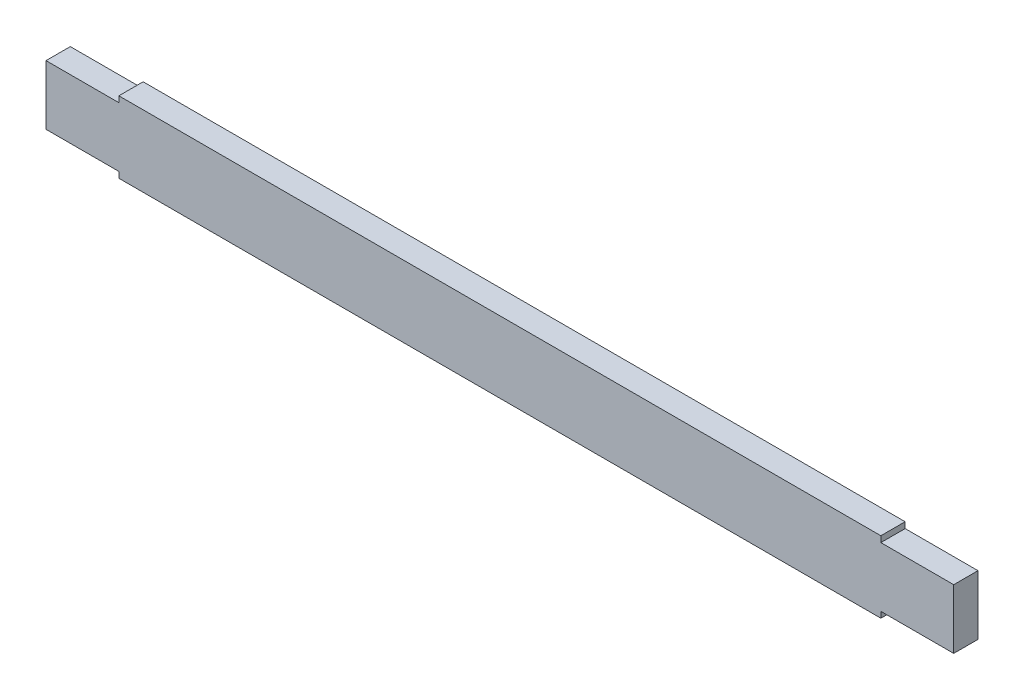
ISO-10303-21;
HEADER;
FILE_DESCRIPTION(('STEP AP214'),'2;1');
FILE_NAME('part.step','',(''),(''),'','','');
FILE_SCHEMA(('AUTOMOTIVE_DESIGN { 1 0 10303 214 1 1 1 1 }'));
ENDSEC;
DATA;
#1=APPLICATION_CONTEXT('core data for automotive mechanical design processes');
#2=APPLICATION_PROTOCOL_DEFINITION('international standard','automotive_design',2000,#1);
#3=PRODUCT_CONTEXT('',#1,'mechanical');
#4=PRODUCT('Part','Part','',(#3));
#5=PRODUCT_RELATED_PRODUCT_CATEGORY('part','',(#4));
#6=PRODUCT_DEFINITION_FORMATION('','',#4);
#7=PRODUCT_DEFINITION_CONTEXT('part definition',#1,'design');
#8=PRODUCT_DEFINITION('design','',#6,#7);
#9=PRODUCT_DEFINITION_SHAPE('','',#8);
#10=(LENGTH_UNIT() NAMED_UNIT(*) SI_UNIT(.MILLI.,.METRE.));
#11=(NAMED_UNIT(*) PLANE_ANGLE_UNIT() SI_UNIT($,.RADIAN.));
#12=(NAMED_UNIT(*) SI_UNIT($,.STERADIAN.) SOLID_ANGLE_UNIT());
#13=UNCERTAINTY_MEASURE_WITH_UNIT(LENGTH_MEASURE(1.E-05),#10,'distance_accuracy_value','');
#14=(GEOMETRIC_REPRESENTATION_CONTEXT(3) GLOBAL_UNCERTAINTY_ASSIGNED_CONTEXT((#13)) GLOBAL_UNIT_ASSIGNED_CONTEXT((#10,
#11,#12)) REPRESENTATION_CONTEXT('',''));
#15=CARTESIAN_POINT('',(0.,0.,0.));
#16=DIRECTION('',(0.,0.,1.));
#17=DIRECTION('',(1.,0.,0.));
#18=AXIS2_PLACEMENT_3D('',#15,#16,#17);
#19=CARTESIAN_POINT('',(80.,7.50000000000001,5.1));
#20=DIRECTION('',(0.,-1.,0.));
#21=DIRECTION('',(1.,0.,0.));
#22=AXIS2_PLACEMENT_3D('',#19,#20,#21);
#23=PLANE('',#22);
#24=DIRECTION('',(-1.,0.,0.));
#25=VECTOR('',#24,1.);
#26=CARTESIAN_POINT('',(80.,7.50000000000001,0.));
#27=LINE('',#26,#25);
#28=CARTESIAN_POINT('',(80.,7.50000000000001,0.));
#29=VERTEX_POINT('',#28);
#30=CARTESIAN_POINT('',(-80.,7.49999999999999,0.));
#31=VERTEX_POINT('',#30);
#32=EDGE_CURVE('E153',#29,#31,#27,.T.);
#33=ORIENTED_EDGE('',*,*,#32,.T.);
#34=DIRECTION('',(0.,0.,-1.));
#35=VECTOR('',#34,1.);
#36=CARTESIAN_POINT('',(-80.,7.49999999999999,5.1));
#37=LINE('',#36,#35);
#38=CARTESIAN_POINT('',(-80.,7.49999999999999,5.1));
#39=VERTEX_POINT('',#38);
#40=EDGE_CURVE('E11',#39,#31,#37,.T.);
#41=ORIENTED_EDGE('',*,*,#40,.F.);
#42=DIRECTION('',(-1.,0.,0.));
#43=VECTOR('',#42,1.);
#44=CARTESIAN_POINT('',(80.,7.50000000000001,5.1));
#45=LINE('',#44,#43);
#46=CARTESIAN_POINT('',(80.,7.50000000000001,5.1));
#47=VERTEX_POINT('',#46);
#48=EDGE_CURVE('E175',#47,#39,#45,.T.);
#49=ORIENTED_EDGE('',*,*,#48,.F.);
#50=DIRECTION('',(0.,0.,-1.));
#51=VECTOR('',#50,1.);
#52=CARTESIAN_POINT('',(80.,7.50000000000001,5.1));
#53=LINE('',#52,#51);
#54=EDGE_CURVE('E149',#47,#29,#53,.T.);
#55=ORIENTED_EDGE('',*,*,#54,.T.);
#56=EDGE_LOOP('',(#33,#41,#49,#55));
#57=FACE_BOUND('',#56,.T.);
#58=ADVANCED_FACE('F33',(#57),#23,.F.);
#59=CARTESIAN_POINT('',(-80.,6.25,5.1));
#60=DIRECTION('',(1.,0.,0.));
#61=DIRECTION('',(0.,0.,-1.));
#62=AXIS2_PLACEMENT_3D('',#59,#60,#61);
#63=PLANE('',#62);
#64=DIRECTION('',(0.,-1.,0.));
#65=VECTOR('',#64,1.);
#66=CARTESIAN_POINT('',(-80.,6.25,0.));
#67=LINE('',#66,#65);
#68=CARTESIAN_POINT('',(-80.,6.25,0.));
#69=VERTEX_POINT('',#68);
#70=EDGE_CURVE('E156',#31,#69,#67,.T.);
#71=ORIENTED_EDGE('',*,*,#70,.T.);
#72=DIRECTION('',(0.,0.,-1.));
#73=VECTOR('',#72,1.);
#74=CARTESIAN_POINT('',(-80.,6.25,5.1));
#75=LINE('',#74,#73);
#76=CARTESIAN_POINT('',(-80.,6.25,5.1));
#77=VERTEX_POINT('',#76);
#78=EDGE_CURVE('E41',#77,#69,#75,.T.);
#79=ORIENTED_EDGE('',*,*,#78,.F.);
#80=DIRECTION('',(0.,-1.,0.));
#81=VECTOR('',#80,1.);
#82=CARTESIAN_POINT('',(-80.,6.25,5.1));
#83=LINE('',#82,#81);
#84=EDGE_CURVE('E104',#39,#77,#83,.T.);
#85=ORIENTED_EDGE('',*,*,#84,.F.);
#86=ORIENTED_EDGE('',*,*,#40,.T.);
#87=EDGE_LOOP('',(#71,#79,#85,#86));
#88=FACE_BOUND('',#87,.T.);
#89=ADVANCED_FACE('F253',(#88),#63,.F.);
#90=CARTESIAN_POINT('',(-80.,6.25,5.1));
#91=DIRECTION('',(0.,-1.,0.));
#92=DIRECTION('',(1.,0.,0.));
#93=AXIS2_PLACEMENT_3D('',#90,#91,#92);
#94=PLANE('',#93);
#95=DIRECTION('',(-1.,0.,0.));
#96=VECTOR('',#95,1.);
#97=CARTESIAN_POINT('',(-80.,6.25,0.));
#98=LINE('',#97,#96);
#99=CARTESIAN_POINT('',(-95.3,6.25,0.));
#100=VERTEX_POINT('',#99);
#101=EDGE_CURVE('E158',#69,#100,#98,.T.);
#102=ORIENTED_EDGE('',*,*,#101,.T.);
#103=DIRECTION('',(0.,0.,-1.));
#104=VECTOR('',#103,1.);
#105=CARTESIAN_POINT('',(-95.3,6.25,5.1));
#106=LINE('',#105,#104);
#107=CARTESIAN_POINT('',(-95.3,6.25,5.1));
#108=VERTEX_POINT('',#107);
#109=EDGE_CURVE('E194',#108,#100,#106,.T.);
#110=ORIENTED_EDGE('',*,*,#109,.F.);
#111=DIRECTION('',(-1.,0.,0.));
#112=VECTOR('',#111,1.);
#113=CARTESIAN_POINT('',(-80.,6.25,5.1));
#114=LINE('',#113,#112);
#115=EDGE_CURVE('E202',#77,#108,#114,.T.);
#116=ORIENTED_EDGE('',*,*,#115,.F.);
#117=ORIENTED_EDGE('',*,*,#78,.T.);
#118=EDGE_LOOP('',(#102,#110,#116,#117));
#119=FACE_BOUND('',#118,.T.);
#120=ADVANCED_FACE('F200',(#119),#94,.F.);
#121=CARTESIAN_POINT('',(-95.3,6.25,5.1));
#122=DIRECTION('',(1.,0.,0.));
#123=DIRECTION('',(0.,0.,-1.));
#124=AXIS2_PLACEMENT_3D('',#121,#122,#123);
#125=PLANE('',#124);
#126=DIRECTION('',(0.,-1.,0.));
#127=VECTOR('',#126,1.);
#128=CARTESIAN_POINT('',(-95.3,6.25,0.));
#129=LINE('',#128,#127);
#130=CARTESIAN_POINT('',(-95.3,-6.25,0.));
#131=VERTEX_POINT('',#130);
#132=EDGE_CURVE('E160',#100,#131,#129,.T.);
#133=ORIENTED_EDGE('',*,*,#132,.T.);
#134=DIRECTION('',(0.,0.,-1.));
#135=VECTOR('',#134,1.);
#136=CARTESIAN_POINT('',(-95.3,-6.25,5.1));
#137=LINE('',#136,#135);
#138=CARTESIAN_POINT('',(-95.3,-6.25,5.1));
#139=VERTEX_POINT('',#138);
#140=EDGE_CURVE('E191',#139,#131,#137,.T.);
#141=ORIENTED_EDGE('',*,*,#140,.F.);
#142=DIRECTION('',(0.,-1.,0.));
#143=VECTOR('',#142,1.);
#144=CARTESIAN_POINT('',(-95.3,6.25,5.1));
#145=LINE('',#144,#143);
#146=EDGE_CURVE('E220',#108,#139,#145,.T.);
#147=ORIENTED_EDGE('',*,*,#146,.F.);
#148=ORIENTED_EDGE('',*,*,#109,.T.);
#149=EDGE_LOOP('',(#133,#141,#147,#148));
#150=FACE_BOUND('',#149,.T.);
#151=ADVANCED_FACE('F211',(#150),#125,.F.);
#152=CARTESIAN_POINT('',(-80.,-6.25,5.1));
#153=DIRECTION('',(0.,1.,0.));
#154=DIRECTION('',(-1.,0.,0.));
#155=AXIS2_PLACEMENT_3D('',#152,#153,#154);
#156=PLANE('',#155);
#157=DIRECTION('',(1.,0.,0.));
#158=VECTOR('',#157,1.);
#159=CARTESIAN_POINT('',(-80.,-6.25,0.));
#160=LINE('',#159,#158);
#161=CARTESIAN_POINT('',(-80.,-6.25,0.));
#162=VERTEX_POINT('',#161);
#163=EDGE_CURVE('E162',#131,#162,#160,.T.);
#164=ORIENTED_EDGE('',*,*,#163,.T.);
#165=DIRECTION('',(0.,0.,-1.));
#166=VECTOR('',#165,1.);
#167=CARTESIAN_POINT('',(-80.,-6.25,5.1));
#168=LINE('',#167,#166);
#169=CARTESIAN_POINT('',(-80.,-6.25,5.1));
#170=VERTEX_POINT('',#169);
#171=EDGE_CURVE('E188',#170,#162,#168,.T.);
#172=ORIENTED_EDGE('',*,*,#171,.F.);
#173=DIRECTION('',(1.,0.,0.));
#174=VECTOR('',#173,1.);
#175=CARTESIAN_POINT('',(-80.,-6.25,5.1));
#176=LINE('',#175,#174);
#177=EDGE_CURVE('E217',#139,#170,#176,.T.);
#178=ORIENTED_EDGE('',*,*,#177,.F.);
#179=ORIENTED_EDGE('',*,*,#140,.T.);
#180=EDGE_LOOP('',(#164,#172,#178,#179));
#181=FACE_BOUND('',#180,.T.);
#182=ADVANCED_FACE('F215',(#181),#156,.F.);
#183=CARTESIAN_POINT('',(-80.,-7.50000000000001,5.1));
#184=DIRECTION('',(1.,0.,0.));
#185=DIRECTION('',(0.,0.,-1.));
#186=AXIS2_PLACEMENT_3D('',#183,#184,#185);
#187=PLANE('',#186);
#188=DIRECTION('',(0.,-1.,0.));
#189=VECTOR('',#188,1.);
#190=CARTESIAN_POINT('',(-80.,-7.50000000000001,0.));
#191=LINE('',#190,#189);
#192=CARTESIAN_POINT('',(-80.,-7.50000000000001,0.));
#193=VERTEX_POINT('',#192);
#194=EDGE_CURVE('E164',#162,#193,#191,.T.);
#195=ORIENTED_EDGE('',*,*,#194,.T.);
#196=DIRECTION('',(0.,0.,-1.));
#197=VECTOR('',#196,1.);
#198=CARTESIAN_POINT('',(-80.,-7.50000000000001,5.1));
#199=LINE('',#198,#197);
#200=CARTESIAN_POINT('',(-80.,-7.50000000000001,5.1));
#201=VERTEX_POINT('',#200);
#202=EDGE_CURVE('E185',#201,#193,#199,.T.);
#203=ORIENTED_EDGE('',*,*,#202,.F.);
#204=DIRECTION('',(0.,-1.,0.));
#205=VECTOR('',#204,1.);
#206=CARTESIAN_POINT('',(-80.,-7.50000000000001,5.1));
#207=LINE('',#206,#205);
#208=EDGE_CURVE('E219',#170,#201,#207,.T.);
#209=ORIENTED_EDGE('',*,*,#208,.F.);
#210=ORIENTED_EDGE('',*,*,#171,.T.);
#211=EDGE_LOOP('',(#195,#203,#209,#210));
#212=FACE_BOUND('',#211,.T.);
#213=ADVANCED_FACE('F266',(#212),#187,.F.);
#214=CARTESIAN_POINT('',(80.,-7.49999999999999,5.1));
#215=DIRECTION('',(0.,1.,0.));
#216=DIRECTION('',(-1.,0.,0.));
#217=AXIS2_PLACEMENT_3D('',#214,#215,#216);
#218=PLANE('',#217);
#219=DIRECTION('',(1.,0.,0.));
#220=VECTOR('',#219,1.);
#221=CARTESIAN_POINT('',(80.,-7.49999999999999,0.));
#222=LINE('',#221,#220);
#223=CARTESIAN_POINT('',(80.,-7.49999999999999,0.));
#224=VERTEX_POINT('',#223);
#225=EDGE_CURVE('E166',#193,#224,#222,.T.);
#226=ORIENTED_EDGE('',*,*,#225,.T.);
#227=DIRECTION('',(0.,0.,-1.));
#228=VECTOR('',#227,1.);
#229=CARTESIAN_POINT('',(80.,-7.49999999999999,5.1));
#230=LINE('',#229,#228);
#231=CARTESIAN_POINT('',(80.,-7.49999999999999,5.1));
#232=VERTEX_POINT('',#231);
#233=EDGE_CURVE('E182',#232,#224,#230,.T.);
#234=ORIENTED_EDGE('',*,*,#233,.F.);
#235=DIRECTION('',(1.,0.,0.));
#236=VECTOR('',#235,1.);
#237=CARTESIAN_POINT('',(80.,-7.49999999999999,5.1));
#238=LINE('',#237,#236);
#239=EDGE_CURVE('E222',#201,#232,#238,.T.);
#240=ORIENTED_EDGE('',*,*,#239,.F.);
#241=ORIENTED_EDGE('',*,*,#202,.T.);
#242=EDGE_LOOP('',(#226,#234,#240,#241));
#243=FACE_BOUND('',#242,.T.);
#244=ADVANCED_FACE('F269',(#243),#218,.F.);
#245=CARTESIAN_POINT('',(80.,-7.49999999999999,5.1));
#246=DIRECTION('',(-1.,0.,0.));
#247=DIRECTION('',(0.,0.,1.));
#248=AXIS2_PLACEMENT_3D('',#245,#246,#247);
#249=PLANE('',#248);
#250=DIRECTION('',(0.,1.,0.));
#251=VECTOR('',#250,1.);
#252=CARTESIAN_POINT('',(80.,-7.49999999999999,0.));
#253=LINE('',#252,#251);
#254=CARTESIAN_POINT('',(80.,-6.25,0.));
#255=VERTEX_POINT('',#254);
#256=EDGE_CURVE('E168',#224,#255,#253,.T.);
#257=ORIENTED_EDGE('',*,*,#256,.T.);
#258=DIRECTION('',(0.,0.,-1.));
#259=VECTOR('',#258,1.);
#260=CARTESIAN_POINT('',(80.,-6.25,5.1));
#261=LINE('',#260,#259);
#262=CARTESIAN_POINT('',(80.,-6.25,5.1));
#263=VERTEX_POINT('',#262);
#264=EDGE_CURVE('E179',#263,#255,#261,.T.);
#265=ORIENTED_EDGE('',*,*,#264,.F.);
#266=DIRECTION('',(0.,1.,0.));
#267=VECTOR('',#266,1.);
#268=CARTESIAN_POINT('',(80.,-7.49999999999999,5.1));
#269=LINE('',#268,#267);
#270=EDGE_CURVE('E228',#232,#263,#269,.T.);
#271=ORIENTED_EDGE('',*,*,#270,.F.);
#272=ORIENTED_EDGE('',*,*,#233,.T.);
#273=EDGE_LOOP('',(#257,#265,#271,#272));
#274=FACE_BOUND('',#273,.T.);
#275=ADVANCED_FACE('F234',(#274),#249,.F.);
#276=CARTESIAN_POINT('',(80.,-6.25,5.1));
#277=DIRECTION('',(0.,1.,0.));
#278=DIRECTION('',(0.,0.,1.));
#279=AXIS2_PLACEMENT_3D('',#276,#277,#278);
#280=PLANE('',#279);
#281=DIRECTION('',(1.,0.,0.));
#282=VECTOR('',#281,1.);
#283=CARTESIAN_POINT('',(80.,-6.25,0.));
#284=LINE('',#283,#282);
#285=CARTESIAN_POINT('',(95.3,-6.25,0.));
#286=VERTEX_POINT('',#285);
#287=EDGE_CURVE('E170',#255,#286,#284,.T.);
#288=ORIENTED_EDGE('',*,*,#287,.T.);
#289=DIRECTION('',(0.,0.,-1.));
#290=VECTOR('',#289,1.);
#291=CARTESIAN_POINT('',(95.3,-6.25,5.1));
#292=LINE('',#291,#290);
#293=CARTESIAN_POINT('',(95.3,-6.25,5.1));
#294=VERTEX_POINT('',#293);
#295=EDGE_CURVE('E144',#294,#286,#292,.T.);
#296=ORIENTED_EDGE('',*,*,#295,.F.);
#297=DIRECTION('',(1.,0.,0.));
#298=VECTOR('',#297,1.);
#299=CARTESIAN_POINT('',(80.,-6.25,5.1));
#300=LINE('',#299,#298);
#301=EDGE_CURVE('E135',#263,#294,#300,.T.);
#302=ORIENTED_EDGE('',*,*,#301,.F.);
#303=ORIENTED_EDGE('',*,*,#264,.T.);
#304=EDGE_LOOP('',(#288,#296,#302,#303));
#305=FACE_BOUND('',#304,.T.);
#306=ADVANCED_FACE('F238',(#305),#280,.F.);
#307=CARTESIAN_POINT('',(95.3,6.25,5.1));
#308=DIRECTION('',(-1.,0.,0.));
#309=DIRECTION('',(0.,0.,1.));
#310=AXIS2_PLACEMENT_3D('',#307,#308,#309);
#311=PLANE('',#310);
#312=DIRECTION('',(0.,1.,0.));
#313=VECTOR('',#312,1.);
#314=CARTESIAN_POINT('',(95.3,6.25,0.));
#315=LINE('',#314,#313);
#316=CARTESIAN_POINT('',(95.3,6.25,0.));
#317=VERTEX_POINT('',#316);
#318=EDGE_CURVE('E143',#286,#317,#315,.T.);
#319=ORIENTED_EDGE('',*,*,#318,.T.);
#320=DIRECTION('',(0.,0.,-1.));
#321=VECTOR('',#320,1.);
#322=CARTESIAN_POINT('',(95.3,6.25,5.1));
#323=LINE('',#322,#321);
#324=CARTESIAN_POINT('',(95.3,6.25,5.1));
#325=VERTEX_POINT('',#324);
#326=EDGE_CURVE('E140',#325,#317,#323,.T.);
#327=ORIENTED_EDGE('',*,*,#326,.F.);
#328=DIRECTION('',(0.,1.,0.));
#329=VECTOR('',#328,1.);
#330=CARTESIAN_POINT('',(95.3,6.25,5.1));
#331=LINE('',#330,#329);
#332=EDGE_CURVE('E129',#294,#325,#331,.T.);
#333=ORIENTED_EDGE('',*,*,#332,.F.);
#334=ORIENTED_EDGE('',*,*,#295,.T.);
#335=EDGE_LOOP('',(#319,#327,#333,#334));
#336=FACE_BOUND('',#335,.T.);
#337=ADVANCED_FACE('F141',(#336),#311,.F.);
#338=CARTESIAN_POINT('',(80.,6.25,5.1));
#339=DIRECTION('',(0.,-1.,0.));
#340=DIRECTION('',(0.,0.,-1.));
#341=AXIS2_PLACEMENT_3D('',#338,#339,#340);
#342=PLANE('',#341);
#343=DIRECTION('',(-1.,0.,0.));
#344=VECTOR('',#343,1.);
#345=CARTESIAN_POINT('',(80.,6.25,0.));
#346=LINE('',#345,#344);
#347=CARTESIAN_POINT('',(80.,6.25,0.));
#348=VERTEX_POINT('',#347);
#349=EDGE_CURVE('E90',#317,#348,#346,.T.);
#350=ORIENTED_EDGE('',*,*,#349,.T.);
#351=DIRECTION('',(0.,0.,-1.));
#352=VECTOR('',#351,1.);
#353=CARTESIAN_POINT('',(80.,6.25,5.1));
#354=LINE('',#353,#352);
#355=CARTESIAN_POINT('',(80.,6.25,5.1));
#356=VERTEX_POINT('',#355);
#357=EDGE_CURVE('E145',#356,#348,#354,.T.);
#358=ORIENTED_EDGE('',*,*,#357,.F.);
#359=DIRECTION('',(-1.,0.,0.));
#360=VECTOR('',#359,1.);
#361=CARTESIAN_POINT('',(80.,6.25,5.1));
#362=LINE('',#361,#360);
#363=EDGE_CURVE('E133',#325,#356,#362,.T.);
#364=ORIENTED_EDGE('',*,*,#363,.F.);
#365=ORIENTED_EDGE('',*,*,#326,.T.);
#366=EDGE_LOOP('',(#350,#358,#364,#365));
#367=FACE_BOUND('',#366,.T.);
#368=ADVANCED_FACE('F147',(#367),#342,.F.);
#369=CARTESIAN_POINT('',(80.,6.25,5.1));
#370=DIRECTION('',(-1.,0.,0.));
#371=DIRECTION('',(0.,0.,1.));
#372=AXIS2_PLACEMENT_3D('',#369,#370,#371);
#373=PLANE('',#372);
#374=DIRECTION('',(0.,1.,0.));
#375=VECTOR('',#374,1.);
#376=CARTESIAN_POINT('',(80.,6.25,0.));
#377=LINE('',#376,#375);
#378=EDGE_CURVE('E96',#348,#29,#377,.T.);
#379=ORIENTED_EDGE('',*,*,#378,.T.);
#380=ORIENTED_EDGE('',*,*,#54,.F.);
#381=DIRECTION('',(0.,1.,0.));
#382=VECTOR('',#381,1.);
#383=CARTESIAN_POINT('',(80.,6.25,5.1));
#384=LINE('',#383,#382);
#385=EDGE_CURVE('E49',#356,#47,#384,.T.);
#386=ORIENTED_EDGE('',*,*,#385,.F.);
#387=ORIENTED_EDGE('',*,*,#357,.T.);
#388=EDGE_LOOP('',(#379,#380,#386,#387));
#389=FACE_BOUND('',#388,.T.);
#390=ADVANCED_FACE('F242',(#389),#373,.F.);
#391=CARTESIAN_POINT('',(0.,0.,5.1));
#392=DIRECTION('',(0.,0.,-1.));
#393=DIRECTION('',(-1.,0.,0.));
#394=AXIS2_PLACEMENT_3D('',#391,#392,#393);
#395=PLANE('',#394);
#396=ORIENTED_EDGE('',*,*,#48,.T.);
#397=ORIENTED_EDGE('',*,*,#84,.T.);
#398=ORIENTED_EDGE('',*,*,#115,.T.);
#399=ORIENTED_EDGE('',*,*,#146,.T.);
#400=ORIENTED_EDGE('',*,*,#177,.T.);
#401=ORIENTED_EDGE('',*,*,#208,.T.);
#402=ORIENTED_EDGE('',*,*,#239,.T.);
#403=ORIENTED_EDGE('',*,*,#270,.T.);
#404=ORIENTED_EDGE('',*,*,#301,.T.);
#405=ORIENTED_EDGE('',*,*,#332,.T.);
#406=ORIENTED_EDGE('',*,*,#363,.T.);
#407=ORIENTED_EDGE('',*,*,#385,.T.);
#408=EDGE_LOOP('',(#396,#397,#398,#399,#400,#401,#402,#403,#404,#405,#406,#407));
#409=FACE_BOUND('',#408,.T.);
#410=ADVANCED_FACE('F131',(#409),#395,.F.);
#411=CARTESIAN_POINT('',(0.,0.,0.));
#412=DIRECTION('',(0.,0.,-1.));
#413=DIRECTION('',(-1.,0.,0.));
#414=AXIS2_PLACEMENT_3D('',#411,#412,#413);
#415=PLANE('',#414);
#416=ORIENTED_EDGE('',*,*,#32,.F.);
#417=ORIENTED_EDGE('',*,*,#378,.F.);
#418=ORIENTED_EDGE('',*,*,#349,.F.);
#419=ORIENTED_EDGE('',*,*,#318,.F.);
#420=ORIENTED_EDGE('',*,*,#287,.F.);
#421=ORIENTED_EDGE('',*,*,#256,.F.);
#422=ORIENTED_EDGE('',*,*,#225,.F.);
#423=ORIENTED_EDGE('',*,*,#194,.F.);
#424=ORIENTED_EDGE('',*,*,#163,.F.);
#425=ORIENTED_EDGE('',*,*,#132,.F.);
#426=ORIENTED_EDGE('',*,*,#101,.F.);
#427=ORIENTED_EDGE('',*,*,#70,.F.);
#428=EDGE_LOOP('',(#416,#417,#418,#419,#420,#421,#422,#423,#424,#425,#426,#427));
#429=FACE_BOUND('',#428,.T.);
#430=ADVANCED_FACE('F206',(#429),#415,.T.);
#431=CLOSED_SHELL('',(#58,#89,#120,#151,#182,#213,#244,#275,#306,#337,#368,#390,#410,#430));
#432=MANIFOLD_SOLID_BREP('B2',#431);
#433=ADVANCED_BREP_SHAPE_REPRESENTATION('',(#18,#432),#14);
#434=SHAPE_DEFINITION_REPRESENTATION(#9,#433);
ENDSEC;
END-ISO-10303-21;
